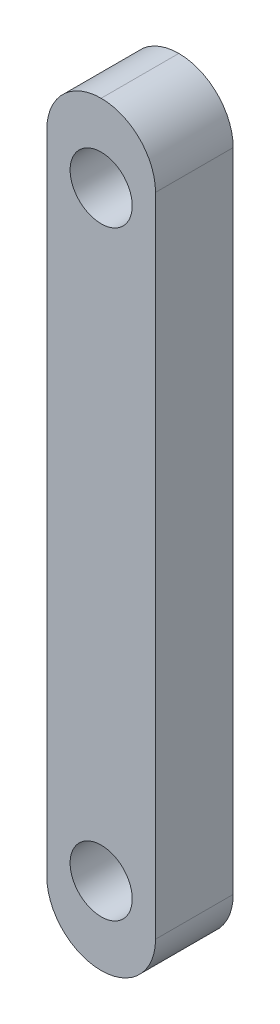
ISO-10303-21;
HEADER;
FILE_DESCRIPTION(('STEP AP214'),'2;1');
FILE_NAME('part.step','',(''),(''),'','','');
FILE_SCHEMA(('AUTOMOTIVE_DESIGN { 1 0 10303 214 1 1 1 1 }'));
ENDSEC;
DATA;
#1=APPLICATION_CONTEXT('core data for automotive mechanical design processes');
#2=APPLICATION_PROTOCOL_DEFINITION('international standard','automotive_design',2000,#1);
#3=PRODUCT_CONTEXT('',#1,'mechanical');
#4=PRODUCT('Part','Part','',(#3));
#5=PRODUCT_RELATED_PRODUCT_CATEGORY('part','',(#4));
#6=PRODUCT_DEFINITION_FORMATION('','',#4);
#7=PRODUCT_DEFINITION_CONTEXT('part definition',#1,'design');
#8=PRODUCT_DEFINITION('design','',#6,#7);
#9=PRODUCT_DEFINITION_SHAPE('','',#8);
#10=(LENGTH_UNIT() NAMED_UNIT(*) SI_UNIT(.MILLI.,.METRE.));
#11=(NAMED_UNIT(*) PLANE_ANGLE_UNIT() SI_UNIT($,.RADIAN.));
#12=(NAMED_UNIT(*) SI_UNIT($,.STERADIAN.) SOLID_ANGLE_UNIT());
#13=UNCERTAINTY_MEASURE_WITH_UNIT(LENGTH_MEASURE(1.E-05),#10,'distance_accuracy_value','');
#14=(GEOMETRIC_REPRESENTATION_CONTEXT(3) GLOBAL_UNCERTAINTY_ASSIGNED_CONTEXT((#13)) GLOBAL_UNIT_ASSIGNED_CONTEXT((#10,
#11,#12)) REPRESENTATION_CONTEXT('',''));
#15=CARTESIAN_POINT('',(0.,0.,0.));
#16=DIRECTION('',(0.,0.,1.));
#17=DIRECTION('',(1.,0.,0.));
#18=AXIS2_PLACEMENT_3D('',#15,#16,#17);
#19=CARTESIAN_POINT('',(-3.5,0.,5.));
#20=DIRECTION('',(1.,0.,0.));
#21=DIRECTION('',(0.,1.,0.));
#22=AXIS2_PLACEMENT_3D('',#19,#20,#21);
#23=PLANE('',#22);
#24=DIRECTION('',(0.,-1.,0.));
#25=VECTOR('',#24,1.);
#26=CARTESIAN_POINT('',(-3.5,0.,5.));
#27=LINE('',#26,#25);
#28=CARTESIAN_POINT('',(-3.5,20.82,5.));
#29=VERTEX_POINT('',#28);
#30=CARTESIAN_POINT('',(-3.50000000000001,-20.82,5.));
#31=VERTEX_POINT('',#30);
#32=EDGE_CURVE('E115',#29,#31,#27,.T.);
#33=ORIENTED_EDGE('',*,*,#32,.F.);
#34=DIRECTION('',(0.,0.,-1.));
#35=VECTOR('',#34,1.);
#36=CARTESIAN_POINT('',(-3.5,20.82,0.));
#37=LINE('',#36,#35);
#38=CARTESIAN_POINT('',(-3.5,20.82,0.));
#39=VERTEX_POINT('',#38);
#40=EDGE_CURVE('E100',#29,#39,#37,.T.);
#41=ORIENTED_EDGE('',*,*,#40,.T.);
#42=DIRECTION('',(0.,-1.,0.));
#43=VECTOR('',#42,1.);
#44=CARTESIAN_POINT('',(-3.5,0.,0.));
#45=LINE('',#44,#43);
#46=CARTESIAN_POINT('',(-3.50000000000001,-20.82,0.));
#47=VERTEX_POINT('',#46);
#48=EDGE_CURVE('E112',#39,#47,#45,.T.);
#49=ORIENTED_EDGE('',*,*,#48,.T.);
#50=DIRECTION('',(0.,0.,-1.));
#51=VECTOR('',#50,1.);
#52=CARTESIAN_POINT('',(-3.50000000000001,-20.82,5.));
#53=LINE('',#52,#51);
#54=EDGE_CURVE('E118',#47,#31,#53,.F.);
#55=ORIENTED_EDGE('',*,*,#54,.T.);
#56=EDGE_LOOP('',(#33,#41,#49,#55));
#57=FACE_BOUND('',#56,.T.);
#58=ADVANCED_FACE('F41',(#57),#23,.F.);
#59=CARTESIAN_POINT('',(3.5,0.,5.));
#60=DIRECTION('',(1.,0.,0.));
#61=DIRECTION('',(0.,1.,0.));
#62=AXIS2_PLACEMENT_3D('',#59,#60,#61);
#63=PLANE('',#62);
#64=DIRECTION('',(0.,-1.,0.));
#65=VECTOR('',#64,1.);
#66=CARTESIAN_POINT('',(3.5,0.,0.));
#67=LINE('',#66,#65);
#68=CARTESIAN_POINT('',(3.5,20.82,0.));
#69=VERTEX_POINT('',#68);
#70=CARTESIAN_POINT('',(3.49999999999999,-20.82,0.));
#71=VERTEX_POINT('',#70);
#72=EDGE_CURVE('E124',#69,#71,#67,.T.);
#73=ORIENTED_EDGE('',*,*,#72,.F.);
#74=DIRECTION('',(0.,0.,-1.));
#75=VECTOR('',#74,1.);
#76=CARTESIAN_POINT('',(3.5,20.82,5.));
#77=LINE('',#76,#75);
#78=CARTESIAN_POINT('',(3.5,20.82,5.));
#79=VERTEX_POINT('',#78);
#80=EDGE_CURVE('E11',#69,#79,#77,.F.);
#81=ORIENTED_EDGE('',*,*,#80,.T.);
#82=DIRECTION('',(0.,-1.,0.));
#83=VECTOR('',#82,1.);
#84=CARTESIAN_POINT('',(3.5,0.,5.));
#85=LINE('',#84,#83);
#86=CARTESIAN_POINT('',(3.49999999999999,-20.82,5.));
#87=VERTEX_POINT('',#86);
#88=EDGE_CURVE('E138',#79,#87,#85,.T.);
#89=ORIENTED_EDGE('',*,*,#88,.T.);
#90=DIRECTION('',(0.,0.,-1.));
#91=VECTOR('',#90,1.);
#92=CARTESIAN_POINT('',(3.49999999999999,-20.82,0.));
#93=LINE('',#92,#91);
#94=EDGE_CURVE('E51',#87,#71,#93,.T.);
#95=ORIENTED_EDGE('',*,*,#94,.T.);
#96=EDGE_LOOP('',(#73,#81,#89,#95));
#97=FACE_BOUND('',#96,.T.);
#98=ADVANCED_FACE('F170',(#97),#63,.T.);
#99=CARTESIAN_POINT('',(0.,-19.32,5.));
#100=DIRECTION('',(0.,0.,-1.));
#101=DIRECTION('',(-1.,0.,0.));
#102=AXIS2_PLACEMENT_3D('',#99,#100,#101);
#103=CYLINDRICAL_SURFACE('',#102,2.);
#104=CARTESIAN_POINT('',(0.,-19.32,5.));
#105=DIRECTION('',(0.,0.,1.));
#106=DIRECTION('',(1.,0.,0.));
#107=AXIS2_PLACEMENT_3D('',#104,#105,#106);
#108=CIRCLE('',#107,2.);
#109=CARTESIAN_POINT('',(2.,-19.32,5.));
#110=VERTEX_POINT('',#109);
#111=EDGE_CURVE('E178',#110,#110,#108,.T.);
#112=ORIENTED_EDGE('',*,*,#111,.T.);
#113=EDGE_LOOP('',(#112));
#114=FACE_BOUND('',#113,.T.);
#115=CARTESIAN_POINT('',(0.,-19.32,0.));
#116=DIRECTION('',(0.,0.,1.));
#117=DIRECTION('',(1.,0.,0.));
#118=AXIS2_PLACEMENT_3D('',#115,#116,#117);
#119=CIRCLE('',#118,2.);
#120=CARTESIAN_POINT('',(2.,-19.32,0.));
#121=VERTEX_POINT('',#120);
#122=EDGE_CURVE('E125',#121,#121,#119,.T.);
#123=ORIENTED_EDGE('',*,*,#122,.F.);
#124=EDGE_LOOP('',(#123));
#125=FACE_BOUND('',#124,.T.);
#126=ADVANCED_FACE('F196',(#114,#125),#103,.F.);
#127=CARTESIAN_POINT('',(0.,19.32,5.));
#128=DIRECTION('',(0.,0.,-1.));
#129=DIRECTION('',(-1.,0.,0.));
#130=AXIS2_PLACEMENT_3D('',#127,#128,#129);
#131=CYLINDRICAL_SURFACE('',#130,2.);
#132=CARTESIAN_POINT('',(0.,19.32,5.));
#133=DIRECTION('',(0.,0.,1.));
#134=DIRECTION('',(1.,0.,0.));
#135=AXIS2_PLACEMENT_3D('',#132,#133,#134);
#136=CIRCLE('',#135,2.);
#137=CARTESIAN_POINT('',(2.,19.32,5.));
#138=VERTEX_POINT('',#137);
#139=EDGE_CURVE('E130',#138,#138,#136,.T.);
#140=ORIENTED_EDGE('',*,*,#139,.T.);
#141=EDGE_LOOP('',(#140));
#142=FACE_BOUND('',#141,.T.);
#143=CARTESIAN_POINT('',(0.,19.32,0.));
#144=DIRECTION('',(0.,0.,1.));
#145=DIRECTION('',(1.,0.,0.));
#146=AXIS2_PLACEMENT_3D('',#143,#144,#145);
#147=CIRCLE('',#146,2.);
#148=CARTESIAN_POINT('',(2.,19.32,0.));
#149=VERTEX_POINT('',#148);
#150=EDGE_CURVE('E133',#149,#149,#147,.T.);
#151=ORIENTED_EDGE('',*,*,#150,.F.);
#152=EDGE_LOOP('',(#151));
#153=FACE_BOUND('',#152,.T.);
#154=ADVANCED_FACE('F188',(#142,#153),#131,.F.);
#155=CARTESIAN_POINT('',(0.,0.,5.));
#156=DIRECTION('',(0.,0.,1.));
#157=DIRECTION('',(1.,0.,0.));
#158=AXIS2_PLACEMENT_3D('',#155,#156,#157);
#159=PLANE('',#158);
#160=ORIENTED_EDGE('',*,*,#139,.F.);
#161=EDGE_LOOP('',(#160));
#162=FACE_BOUND('',#161,.T.);
#163=ORIENTED_EDGE('',*,*,#111,.F.);
#164=EDGE_LOOP('',(#163));
#165=FACE_BOUND('',#164,.T.);
#166=CARTESIAN_POINT('',(0.,20.82,5.));
#167=DIRECTION('',(0.,0.,1.));
#168=DIRECTION('',(1.,0.,0.));
#169=AXIS2_PLACEMENT_3D('',#166,#167,#168);
#170=CIRCLE('',#169,3.5);
#171=CARTESIAN_POINT('',(0.,24.32,5.));
#172=VERTEX_POINT('',#171);
#173=EDGE_CURVE('E59',#79,#172,#170,.T.);
#174=ORIENTED_EDGE('',*,*,#173,.T.);
#175=CARTESIAN_POINT('',(0.,20.82,5.));
#176=DIRECTION('',(0.,0.,1.));
#177=DIRECTION('',(1.,0.,0.));
#178=AXIS2_PLACEMENT_3D('',#175,#176,#177);
#179=CIRCLE('',#178,3.5);
#180=EDGE_CURVE('E153',#172,#29,#179,.T.);
#181=ORIENTED_EDGE('',*,*,#180,.T.);
#182=ORIENTED_EDGE('',*,*,#32,.T.);
#183=CARTESIAN_POINT('',(0.,-20.82,5.));
#184=DIRECTION('',(0.,0.,1.));
#185=DIRECTION('',(1.,0.,0.));
#186=AXIS2_PLACEMENT_3D('',#183,#184,#185);
#187=CIRCLE('',#186,3.5);
#188=CARTESIAN_POINT('',(0.,-24.32,5.));
#189=VERTEX_POINT('',#188);
#190=EDGE_CURVE('E148',#31,#189,#187,.T.);
#191=ORIENTED_EDGE('',*,*,#190,.T.);
#192=CARTESIAN_POINT('',(0.,-20.82,5.));
#193=DIRECTION('',(0.,0.,1.));
#194=DIRECTION('',(1.,0.,0.));
#195=AXIS2_PLACEMENT_3D('',#192,#193,#194);
#196=CIRCLE('',#195,3.5);
#197=EDGE_CURVE('E65',#189,#87,#196,.T.);
#198=ORIENTED_EDGE('',*,*,#197,.T.);
#199=ORIENTED_EDGE('',*,*,#88,.F.);
#200=EDGE_LOOP('',(#174,#181,#182,#191,#198,#199));
#201=FACE_BOUND('',#200,.T.);
#202=ADVANCED_FACE('F174',(#162,#165,#201),#159,.T.);
#203=CARTESIAN_POINT('',(0.,0.,0.));
#204=DIRECTION('',(0.,0.,1.));
#205=DIRECTION('',(1.,0.,0.));
#206=AXIS2_PLACEMENT_3D('',#203,#204,#205);
#207=PLANE('',#206);
#208=ORIENTED_EDGE('',*,*,#150,.T.);
#209=EDGE_LOOP('',(#208));
#210=FACE_BOUND('',#209,.T.);
#211=ORIENTED_EDGE('',*,*,#122,.T.);
#212=EDGE_LOOP('',(#211));
#213=FACE_BOUND('',#212,.T.);
#214=ORIENTED_EDGE('',*,*,#48,.F.);
#215=CARTESIAN_POINT('',(0.,20.82,0.));
#216=DIRECTION('',(0.,0.,1.));
#217=DIRECTION('',(1.,0.,0.));
#218=AXIS2_PLACEMENT_3D('',#215,#216,#217);
#219=CIRCLE('',#218,3.5);
#220=CARTESIAN_POINT('',(0.,24.32,0.));
#221=VERTEX_POINT('',#220);
#222=EDGE_CURVE('E96',#39,#221,#219,.F.);
#223=ORIENTED_EDGE('',*,*,#222,.T.);
#224=CARTESIAN_POINT('',(0.,20.82,0.));
#225=DIRECTION('',(0.,0.,1.));
#226=DIRECTION('',(1.,0.,0.));
#227=AXIS2_PLACEMENT_3D('',#224,#225,#226);
#228=CIRCLE('',#227,3.5);
#229=EDGE_CURVE('E106',#221,#69,#228,.F.);
#230=ORIENTED_EDGE('',*,*,#229,.T.);
#231=ORIENTED_EDGE('',*,*,#72,.T.);
#232=CARTESIAN_POINT('',(0.,-20.82,0.));
#233=DIRECTION('',(0.,0.,1.));
#234=DIRECTION('',(1.,0.,0.));
#235=AXIS2_PLACEMENT_3D('',#232,#233,#234);
#236=CIRCLE('',#235,3.5);
#237=CARTESIAN_POINT('',(0.,-24.32,0.));
#238=VERTEX_POINT('',#237);
#239=EDGE_CURVE('E117',#71,#238,#236,.F.);
#240=ORIENTED_EDGE('',*,*,#239,.T.);
#241=CARTESIAN_POINT('',(0.,-20.82,0.));
#242=DIRECTION('',(0.,0.,1.));
#243=DIRECTION('',(1.,0.,0.));
#244=AXIS2_PLACEMENT_3D('',#241,#242,#243);
#245=CIRCLE('',#244,3.5);
#246=EDGE_CURVE('E122',#238,#47,#245,.F.);
#247=ORIENTED_EDGE('',*,*,#246,.T.);
#248=EDGE_LOOP('',(#214,#223,#230,#231,#240,#247));
#249=FACE_BOUND('',#248,.T.);
#250=ADVANCED_FACE('F120',(#210,#213,#249),#207,.F.);
#251=CARTESIAN_POINT('',(0.,20.82,5.));
#252=DIRECTION('',(0.,0.,-1.));
#253=DIRECTION('',(-1.,0.,0.));
#254=AXIS2_PLACEMENT_3D('',#251,#252,#253);
#255=CYLINDRICAL_SURFACE('',#254,3.5);
#256=DIRECTION('',(0.,0.,-1.));
#257=VECTOR('',#256,1.);
#258=CARTESIAN_POINT('',(0.,24.32,5.));
#259=LINE('',#258,#257);
#260=EDGE_CURVE('E101',#172,#221,#259,.T.);
#261=ORIENTED_EDGE('',*,*,#260,.F.);
#262=ORIENTED_EDGE('',*,*,#173,.F.);
#263=ORIENTED_EDGE('',*,*,#80,.F.);
#264=ORIENTED_EDGE('',*,*,#229,.F.);
#265=EDGE_LOOP('',(#261,#262,#263,#264));
#266=FACE_BOUND('',#265,.T.);
#267=ADVANCED_FACE('F173',(#266),#255,.T.);
#268=CARTESIAN_POINT('',(0.,20.82,5.));
#269=DIRECTION('',(0.,0.,1.));
#270=DIRECTION('',(1.,0.,0.));
#271=AXIS2_PLACEMENT_3D('',#268,#269,#270);
#272=CYLINDRICAL_SURFACE('',#271,3.5);
#273=ORIENTED_EDGE('',*,*,#180,.F.);
#274=ORIENTED_EDGE('',*,*,#260,.T.);
#275=ORIENTED_EDGE('',*,*,#222,.F.);
#276=ORIENTED_EDGE('',*,*,#40,.F.);
#277=EDGE_LOOP('',(#273,#274,#275,#276));
#278=FACE_BOUND('',#277,.T.);
#279=ADVANCED_FACE('F99',(#278),#272,.T.);
#280=CARTESIAN_POINT('',(0.,-20.82,5.));
#281=DIRECTION('',(0.,0.,1.));
#282=DIRECTION('',(1.,0.,0.));
#283=AXIS2_PLACEMENT_3D('',#280,#281,#282);
#284=CYLINDRICAL_SURFACE('',#283,3.5);
#285=ORIENTED_EDGE('',*,*,#94,.F.);
#286=ORIENTED_EDGE('',*,*,#197,.F.);
#287=DIRECTION('',(0.,0.,-1.));
#288=VECTOR('',#287,1.);
#289=CARTESIAN_POINT('',(0.,-24.32,5.));
#290=LINE('',#289,#288);
#291=EDGE_CURVE('E45',#238,#189,#290,.F.);
#292=ORIENTED_EDGE('',*,*,#291,.F.);
#293=ORIENTED_EDGE('',*,*,#239,.F.);
#294=EDGE_LOOP('',(#285,#286,#292,#293));
#295=FACE_BOUND('',#294,.T.);
#296=ADVANCED_FACE('F43',(#295),#284,.T.);
#297=CARTESIAN_POINT('',(0.,-20.82,5.));
#298=DIRECTION('',(0.,0.,-1.));
#299=DIRECTION('',(-1.,0.,0.));
#300=AXIS2_PLACEMENT_3D('',#297,#298,#299);
#301=CYLINDRICAL_SURFACE('',#300,3.5);
#302=ORIENTED_EDGE('',*,*,#190,.F.);
#303=ORIENTED_EDGE('',*,*,#54,.F.);
#304=ORIENTED_EDGE('',*,*,#246,.F.);
#305=ORIENTED_EDGE('',*,*,#291,.T.);
#306=EDGE_LOOP('',(#302,#303,#304,#305));
#307=FACE_BOUND('',#306,.T.);
#308=ADVANCED_FACE('F164',(#307),#301,.T.);
#309=CLOSED_SHELL('',(#58,#98,#126,#154,#202,#250,#267,#279,#296,#308));
#310=MANIFOLD_SOLID_BREP('B2',#309);
#311=ADVANCED_BREP_SHAPE_REPRESENTATION('',(#18,#310),#14);
#312=SHAPE_DEFINITION_REPRESENTATION(#9,#311);
ENDSEC;
END-ISO-10303-21;
